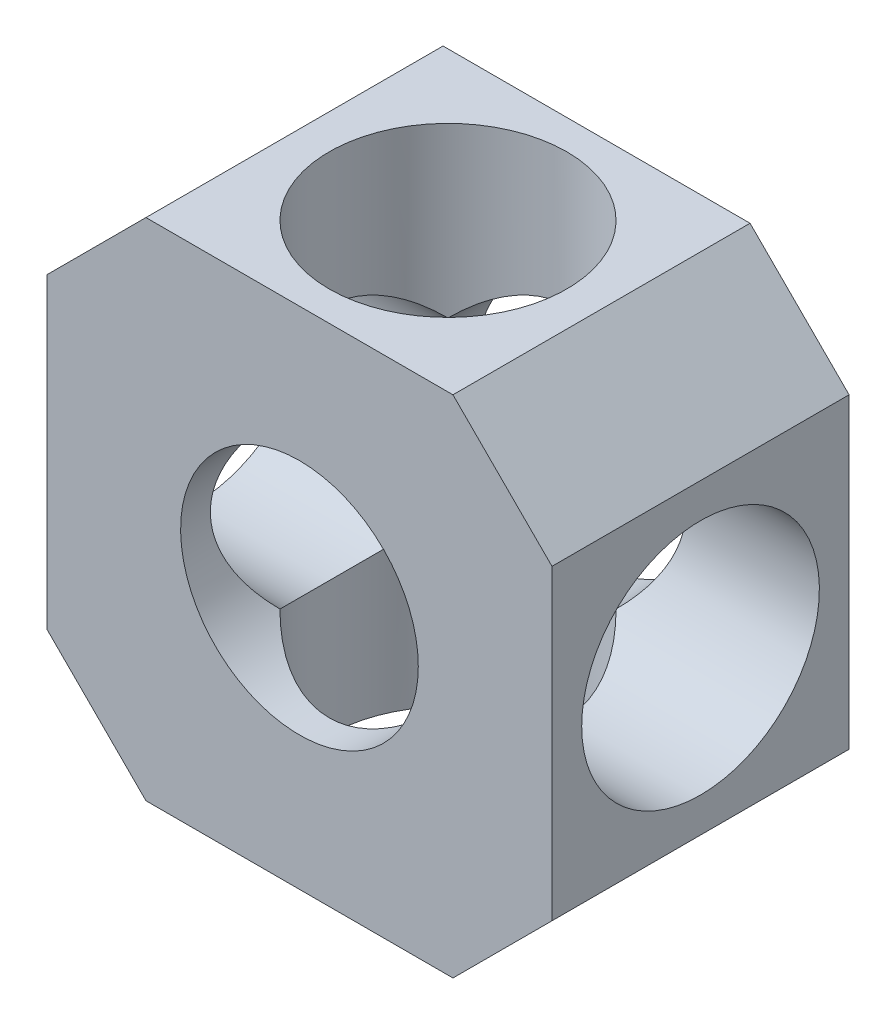
ISO-10303-21;
HEADER;
FILE_DESCRIPTION(('STEP AP214'),'2;1');
FILE_NAME('part.step','',(''),(''),'','','');
FILE_SCHEMA(('AUTOMOTIVE_DESIGN { 1 0 10303 214 1 1 1 1 }'));
ENDSEC;
DATA;
#1=APPLICATION_CONTEXT('core data for automotive mechanical design processes');
#2=APPLICATION_PROTOCOL_DEFINITION('international standard','automotive_design',2000,#1);
#3=PRODUCT_CONTEXT('',#1,'mechanical');
#4=PRODUCT('Part','Part','',(#3));
#5=PRODUCT_RELATED_PRODUCT_CATEGORY('part','',(#4));
#6=PRODUCT_DEFINITION_FORMATION('','',#4);
#7=PRODUCT_DEFINITION_CONTEXT('part definition',#1,'design');
#8=PRODUCT_DEFINITION('design','',#6,#7);
#9=PRODUCT_DEFINITION_SHAPE('','',#8);
#10=(LENGTH_UNIT() NAMED_UNIT(*) SI_UNIT(.MILLI.,.METRE.));
#11=(NAMED_UNIT(*) PLANE_ANGLE_UNIT() SI_UNIT($,.RADIAN.));
#12=(NAMED_UNIT(*) SI_UNIT($,.STERADIAN.) SOLID_ANGLE_UNIT());
#13=UNCERTAINTY_MEASURE_WITH_UNIT(LENGTH_MEASURE(1.E-05),#10,'distance_accuracy_value','');
#14=(GEOMETRIC_REPRESENTATION_CONTEXT(3) GLOBAL_UNCERTAINTY_ASSIGNED_CONTEXT((#13)) GLOBAL_UNIT_ASSIGNED_CONTEXT((#10,
#11,#12)) REPRESENTATION_CONTEXT('',''));
#15=CARTESIAN_POINT('',(0.,0.,0.));
#16=DIRECTION('',(0.,0.,1.));
#17=DIRECTION('',(1.,0.,0.));
#18=AXIS2_PLACEMENT_3D('',#15,#16,#17);
#19=CARTESIAN_POINT('',(0.,0.,6.21710526));
#20=DIRECTION('',(0.,0.,-1.));
#21=DIRECTION('',(-1.,0.,0.));
#22=AXIS2_PLACEMENT_3D('',#19,#20,#21);
#23=CYLINDRICAL_SURFACE('',#22,4.973684208);
#24=CARTESIAN_POINT('',(0.,0.,0.));
#25=DIRECTION('',(0.707106781186547,0.,-0.707106781186547));
#26=DIRECTION('',(-0.707106781186547,0.,-0.707106781186547));
#27=AXIS2_PLACEMENT_3D('',#24,#25,#26);
#28=ELLIPSE('',#27,7.03385166191449,4.973684208);
#29=CARTESIAN_POINT('',(3.51692583095726,-3.51692583095722,3.51692583095723));
#30=VERTEX_POINT('',#29);
#31=CARTESIAN_POINT('',(3.51692583095724,3.51692583095725,3.51692583095725));
#32=VERTEX_POINT('',#31);
#33=EDGE_CURVE('E63',#30,#32,#28,.F.);
#34=ORIENTED_EDGE('',*,*,#33,.F.);
#35=CARTESIAN_POINT('',(0.,0.,0.));
#36=DIRECTION('',(0.,-0.707106781186547,-0.707106781186547));
#37=DIRECTION('',(0.,0.707106781186547,-0.707106781186547));
#38=AXIS2_PLACEMENT_3D('',#35,#36,#37);
#39=ELLIPSE('',#38,7.03385166191449,4.973684208);
#40=CARTESIAN_POINT('',(-3.51692583095723,-3.51692583095727,3.51692583095726));
#41=VERTEX_POINT('',#40);
#42=EDGE_CURVE('E140',#41,#30,#39,.F.);
#43=ORIENTED_EDGE('',*,*,#42,.F.);
#44=CARTESIAN_POINT('',(0.,0.,0.));
#45=DIRECTION('',(-0.707106781186547,0.,-0.707106781186547));
#46=DIRECTION('',(0.707106781186547,0.,-0.707106781186547));
#47=AXIS2_PLACEMENT_3D('',#44,#45,#46);
#48=ELLIPSE('',#47,7.03385166191449,4.973684208);
#49=CARTESIAN_POINT('',(-3.51692583095726,3.51692583095722,3.51692583095723));
#50=VERTEX_POINT('',#49);
#51=EDGE_CURVE('E128',#50,#41,#48,.F.);
#52=ORIENTED_EDGE('',*,*,#51,.F.);
#53=CARTESIAN_POINT('',(0.,0.,0.));
#54=DIRECTION('',(0.,0.707106781186547,-0.707106781186547));
#55=DIRECTION('',(0.,-0.707106781186547,-0.707106781186547));
#56=AXIS2_PLACEMENT_3D('',#53,#54,#55);
#57=ELLIPSE('',#56,7.03385166191449,4.973684208);
#58=EDGE_CURVE('E134',#32,#50,#57,.F.);
#59=ORIENTED_EDGE('',*,*,#58,.F.);
#60=EDGE_LOOP('',(#34,#43,#52,#59));
#61=FACE_BOUND('',#60,.T.);
#62=CARTESIAN_POINT('',(0.,0.,6.21710526));
#63=DIRECTION('',(0.,0.,1.));
#64=DIRECTION('',(1.,0.,0.));
#65=AXIS2_PLACEMENT_3D('',#62,#63,#64);
#66=CIRCLE('',#65,4.973684208);
#67=CARTESIAN_POINT('',(4.973684208,0.,6.21710526));
#68=VERTEX_POINT('',#67);
#69=EDGE_CURVE('E196',#68,#68,#66,.T.);
#70=ORIENTED_EDGE('',*,*,#69,.T.);
#71=EDGE_LOOP('',(#70));
#72=FACE_BOUND('',#71,.T.);
#73=ADVANCED_FACE('F40',(#61,#72),#23,.F.);
#74=CARTESIAN_POINT('',(0.,0.,6.21710526));
#75=DIRECTION('',(0.,0.,1.));
#76=DIRECTION('',(1.,0.,0.));
#77=AXIS2_PLACEMENT_3D('',#74,#75,#76);
#78=PLANE('',#77);
#79=DIRECTION('',(-0.707106781186548,0.707106781186548,0.));
#80=VECTOR('',#79,1.);
#81=CARTESIAN_POINT('',(6.424342102,10.569078942,6.21710526));
#82=LINE('',#81,#80);
#83=CARTESIAN_POINT('',(10.569078942,6.424342102,6.21710526));
#84=VERTEX_POINT('',#83);
#85=CARTESIAN_POINT('',(6.424342102,10.569078942,6.21710526));
#86=VERTEX_POINT('',#85);
#87=EDGE_CURVE('E180',#84,#86,#82,.T.);
#88=ORIENTED_EDGE('',*,*,#87,.T.);
#89=DIRECTION('',(-1.,0.,0.));
#90=VECTOR('',#89,1.);
#91=CARTESIAN_POINT('',(-6.424342102,10.569078942,6.21710526));
#92=LINE('',#91,#90);
#93=CARTESIAN_POINT('',(-6.424342102,10.569078942,6.21710526));
#94=VERTEX_POINT('',#93);
#95=EDGE_CURVE('E208',#86,#94,#92,.T.);
#96=ORIENTED_EDGE('',*,*,#95,.T.);
#97=DIRECTION('',(-0.707106781186548,-0.707106781186548,0.));
#98=VECTOR('',#97,1.);
#99=CARTESIAN_POINT('',(-10.569078942,6.424342102,6.21710526));
#100=LINE('',#99,#98);
#101=CARTESIAN_POINT('',(-10.569078942,6.424342102,6.21710526));
#102=VERTEX_POINT('',#101);
#103=EDGE_CURVE('E206',#94,#102,#100,.T.);
#104=ORIENTED_EDGE('',*,*,#103,.T.);
#105=DIRECTION('',(0.,-1.,0.));
#106=VECTOR('',#105,1.);
#107=CARTESIAN_POINT('',(-10.569078942,6.424342102,6.21710526));
#108=LINE('',#107,#106);
#109=CARTESIAN_POINT('',(-10.569078942,-6.424342102,6.21710526));
#110=VERTEX_POINT('',#109);
#111=EDGE_CURVE('E204',#102,#110,#108,.T.);
#112=ORIENTED_EDGE('',*,*,#111,.T.);
#113=DIRECTION('',(0.707106781186548,-0.707106781186548,0.));
#114=VECTOR('',#113,1.);
#115=CARTESIAN_POINT('',(-10.569078942,-6.424342102,6.21710526));
#116=LINE('',#115,#114);
#117=CARTESIAN_POINT('',(-6.424342102,-10.569078942,6.21710526));
#118=VERTEX_POINT('',#117);
#119=EDGE_CURVE('E202',#110,#118,#116,.T.);
#120=ORIENTED_EDGE('',*,*,#119,.T.);
#121=DIRECTION('',(1.,0.,0.));
#122=VECTOR('',#121,1.);
#123=CARTESIAN_POINT('',(-6.424342102,-10.569078942,6.21710526));
#124=LINE('',#123,#122);
#125=CARTESIAN_POINT('',(6.424342102,-10.569078942,6.21710526));
#126=VERTEX_POINT('',#125);
#127=EDGE_CURVE('E200',#118,#126,#124,.T.);
#128=ORIENTED_EDGE('',*,*,#127,.T.);
#129=DIRECTION('',(0.707106781186548,0.707106781186548,0.));
#130=VECTOR('',#129,1.);
#131=CARTESIAN_POINT('',(6.424342102,-10.569078942,6.21710526));
#132=LINE('',#131,#130);
#133=CARTESIAN_POINT('',(10.569078942,-6.424342102,6.21710526));
#134=VERTEX_POINT('',#133);
#135=EDGE_CURVE('E198',#126,#134,#132,.T.);
#136=ORIENTED_EDGE('',*,*,#135,.T.);
#137=DIRECTION('',(0.,1.,0.));
#138=VECTOR('',#137,1.);
#139=CARTESIAN_POINT('',(10.569078942,6.424342102,6.21710526));
#140=LINE('',#139,#138);
#141=EDGE_CURVE('E177',#134,#84,#140,.T.);
#142=ORIENTED_EDGE('',*,*,#141,.T.);
#143=EDGE_LOOP('',(#88,#96,#104,#112,#120,#128,#136,#142));
#144=FACE_BOUND('',#143,.T.);
#145=ORIENTED_EDGE('',*,*,#69,.F.);
#146=EDGE_LOOP('',(#145));
#147=FACE_BOUND('',#146,.T.);
#148=ADVANCED_FACE('F274',(#144,#147),#78,.T.);
#149=CARTESIAN_POINT('',(0.,0.,-6.21710526));
#150=DIRECTION('',(0.,0.,1.));
#151=DIRECTION('',(1.,0.,0.));
#152=AXIS2_PLACEMENT_3D('',#149,#150,#151);
#153=PLANE('',#152);
#154=DIRECTION('',(-0.707106781186548,0.707106781186548,0.));
#155=VECTOR('',#154,1.);
#156=CARTESIAN_POINT('',(6.424342102,10.569078942,-6.21710526));
#157=LINE('',#156,#155);
#158=CARTESIAN_POINT('',(10.569078942,6.424342102,-6.21710526));
#159=VERTEX_POINT('',#158);
#160=CARTESIAN_POINT('',(6.424342102,10.569078942,-6.21710526));
#161=VERTEX_POINT('',#160);
#162=EDGE_CURVE('E193',#159,#161,#157,.T.);
#163=ORIENTED_EDGE('',*,*,#162,.F.);
#164=DIRECTION('',(0.,1.,0.));
#165=VECTOR('',#164,1.);
#166=CARTESIAN_POINT('',(10.569078942,6.424342102,-6.21710526));
#167=LINE('',#166,#165);
#168=CARTESIAN_POINT('',(10.569078942,-6.424342102,-6.21710526));
#169=VERTEX_POINT('',#168);
#170=EDGE_CURVE('E178',#169,#159,#167,.T.);
#171=ORIENTED_EDGE('',*,*,#170,.F.);
#172=DIRECTION('',(0.707106781186548,0.707106781186548,0.));
#173=VECTOR('',#172,1.);
#174=CARTESIAN_POINT('',(6.424342102,-10.569078942,-6.21710526));
#175=LINE('',#174,#173);
#176=CARTESIAN_POINT('',(6.424342102,-10.569078942,-6.21710526));
#177=VERTEX_POINT('',#176);
#178=EDGE_CURVE('E181',#177,#169,#175,.T.);
#179=ORIENTED_EDGE('',*,*,#178,.F.);
#180=DIRECTION('',(1.,0.,0.));
#181=VECTOR('',#180,1.);
#182=CARTESIAN_POINT('',(-6.424342102,-10.569078942,-6.21710526));
#183=LINE('',#182,#181);
#184=CARTESIAN_POINT('',(-6.424342102,-10.569078942,-6.21710526));
#185=VERTEX_POINT('',#184);
#186=EDGE_CURVE('E183',#185,#177,#183,.T.);
#187=ORIENTED_EDGE('',*,*,#186,.F.);
#188=DIRECTION('',(0.707106781186548,-0.707106781186548,0.));
#189=VECTOR('',#188,1.);
#190=CARTESIAN_POINT('',(-10.569078942,-6.424342102,-6.21710526));
#191=LINE('',#190,#189);
#192=CARTESIAN_POINT('',(-10.569078942,-6.424342102,-6.21710526));
#193=VERTEX_POINT('',#192);
#194=EDGE_CURVE('E185',#193,#185,#191,.T.);
#195=ORIENTED_EDGE('',*,*,#194,.F.);
#196=DIRECTION('',(0.,-1.,0.));
#197=VECTOR('',#196,1.);
#198=CARTESIAN_POINT('',(-10.569078942,6.424342102,-6.21710526));
#199=LINE('',#198,#197);
#200=CARTESIAN_POINT('',(-10.569078942,6.424342102,-6.21710526));
#201=VERTEX_POINT('',#200);
#202=EDGE_CURVE('E187',#201,#193,#199,.T.);
#203=ORIENTED_EDGE('',*,*,#202,.F.);
#204=DIRECTION('',(-0.707106781186548,-0.707106781186548,0.));
#205=VECTOR('',#204,1.);
#206=CARTESIAN_POINT('',(-10.569078942,6.424342102,-6.21710526));
#207=LINE('',#206,#205);
#208=CARTESIAN_POINT('',(-6.424342102,10.569078942,-6.21710526));
#209=VERTEX_POINT('',#208);
#210=EDGE_CURVE('E189',#209,#201,#207,.T.);
#211=ORIENTED_EDGE('',*,*,#210,.F.);
#212=DIRECTION('',(-1.,0.,0.));
#213=VECTOR('',#212,1.);
#214=CARTESIAN_POINT('',(-6.424342102,10.569078942,-6.21710526));
#215=LINE('',#214,#213);
#216=EDGE_CURVE('E191',#161,#209,#215,.T.);
#217=ORIENTED_EDGE('',*,*,#216,.F.);
#218=EDGE_LOOP('',(#163,#171,#179,#187,#195,#203,#211,#217));
#219=FACE_BOUND('',#218,.T.);
#220=CARTESIAN_POINT('',(0.,0.,-6.21710526));
#221=DIRECTION('',(0.,0.,1.));
#222=DIRECTION('',(1.,0.,0.));
#223=AXIS2_PLACEMENT_3D('',#220,#221,#222);
#224=CIRCLE('',#223,4.973684208);
#225=CARTESIAN_POINT('',(4.973684208,0.,-6.21710526));
#226=VERTEX_POINT('',#225);
#227=EDGE_CURVE('E212',#226,#226,#224,.T.);
#228=ORIENTED_EDGE('',*,*,#227,.T.);
#229=EDGE_LOOP('',(#228));
#230=FACE_BOUND('',#229,.T.);
#231=ADVANCED_FACE('F265',(#219,#230),#153,.F.);
#232=CARTESIAN_POINT('',(6.424342102,10.569078942,6.21710526));
#233=DIRECTION('',(-0.707106781186547,-0.707106781186547,0.));
#234=DIRECTION('',(0.707106781186548,-0.707106781186548,0.));
#235=AXIS2_PLACEMENT_3D('',#232,#233,#234);
#236=PLANE('',#235);
#237=ORIENTED_EDGE('',*,*,#162,.T.);
#238=DIRECTION('',(0.,0.,-1.));
#239=VECTOR('',#238,1.);
#240=CARTESIAN_POINT('',(6.424342102,10.569078942,6.21710526));
#241=LINE('',#240,#239);
#242=EDGE_CURVE('E153',#86,#161,#241,.T.);
#243=ORIENTED_EDGE('',*,*,#242,.F.);
#244=ORIENTED_EDGE('',*,*,#87,.F.);
#245=DIRECTION('',(0.,0.,-1.));
#246=VECTOR('',#245,1.);
#247=CARTESIAN_POINT('',(10.569078942,6.424342102,6.21710526));
#248=LINE('',#247,#246);
#249=EDGE_CURVE('E174',#84,#159,#248,.T.);
#250=ORIENTED_EDGE('',*,*,#249,.T.);
#251=EDGE_LOOP('',(#237,#243,#244,#250));
#252=FACE_BOUND('',#251,.T.);
#253=ADVANCED_FACE('F42',(#252),#236,.F.);
#254=CARTESIAN_POINT('',(-6.424342102,10.569078942,6.21710526));
#255=DIRECTION('',(0.,-1.,0.));
#256=DIRECTION('',(0.,0.,-1.));
#257=AXIS2_PLACEMENT_3D('',#254,#255,#256);
#258=PLANE('',#257);
#259=CARTESIAN_POINT('',(0.,10.569078942,0.));
#260=DIRECTION('',(0.,1.,0.));
#261=DIRECTION('',(0.,0.,1.));
#262=AXIS2_PLACEMENT_3D('',#259,#260,#261);
#263=CIRCLE('',#262,4.973684208);
#264=CARTESIAN_POINT('',(0.,10.569078942,4.973684208));
#265=VERTEX_POINT('',#264);
#266=EDGE_CURVE('E218',#265,#265,#263,.T.);
#267=ORIENTED_EDGE('',*,*,#266,.F.);
#268=EDGE_LOOP('',(#267));
#269=FACE_BOUND('',#268,.T.);
#270=ORIENTED_EDGE('',*,*,#216,.T.);
#271=DIRECTION('',(0.,0.,-1.));
#272=VECTOR('',#271,1.);
#273=CARTESIAN_POINT('',(-6.424342102,10.569078942,6.21710526));
#274=LINE('',#273,#272);
#275=EDGE_CURVE('E156',#94,#209,#274,.T.);
#276=ORIENTED_EDGE('',*,*,#275,.F.);
#277=ORIENTED_EDGE('',*,*,#95,.F.);
#278=ORIENTED_EDGE('',*,*,#242,.T.);
#279=EDGE_LOOP('',(#270,#276,#277,#278));
#280=FACE_BOUND('',#279,.T.);
#281=ADVANCED_FACE('F271',(#269,#280),#258,.F.);
#282=CARTESIAN_POINT('',(-10.569078942,6.424342102,6.21710526));
#283=DIRECTION('',(0.707106781186547,-0.707106781186547,0.));
#284=DIRECTION('',(0.707106781186548,0.707106781186548,0.));
#285=AXIS2_PLACEMENT_3D('',#282,#283,#284);
#286=PLANE('',#285);
#287=ORIENTED_EDGE('',*,*,#210,.T.);
#288=DIRECTION('',(0.,0.,-1.));
#289=VECTOR('',#288,1.);
#290=CARTESIAN_POINT('',(-10.569078942,6.424342102,6.21710526));
#291=LINE('',#290,#289);
#292=EDGE_CURVE('E159',#102,#201,#291,.T.);
#293=ORIENTED_EDGE('',*,*,#292,.F.);
#294=ORIENTED_EDGE('',*,*,#103,.F.);
#295=ORIENTED_EDGE('',*,*,#275,.T.);
#296=EDGE_LOOP('',(#287,#293,#294,#295));
#297=FACE_BOUND('',#296,.T.);
#298=ADVANCED_FACE('F294',(#297),#286,.F.);
#299=CARTESIAN_POINT('',(-10.569078942,6.424342102,6.21710526));
#300=DIRECTION('',(1.,0.,0.));
#301=DIRECTION('',(0.,1.,0.));
#302=AXIS2_PLACEMENT_3D('',#299,#300,#301);
#303=PLANE('',#302);
#304=CARTESIAN_POINT('',(-10.569078942,0.,0.));
#305=DIRECTION('',(-1.,0.,0.));
#306=DIRECTION('',(0.,0.,1.));
#307=AXIS2_PLACEMENT_3D('',#304,#305,#306);
#308=CIRCLE('',#307,4.973684208);
#309=CARTESIAN_POINT('',(-10.569078942,0.,4.973684208));
#310=VERTEX_POINT('',#309);
#311=EDGE_CURVE('E227',#310,#310,#308,.T.);
#312=ORIENTED_EDGE('',*,*,#311,.F.);
#313=EDGE_LOOP('',(#312));
#314=FACE_BOUND('',#313,.T.);
#315=ORIENTED_EDGE('',*,*,#202,.T.);
#316=DIRECTION('',(0.,0.,-1.));
#317=VECTOR('',#316,1.);
#318=CARTESIAN_POINT('',(-10.569078942,-6.424342102,6.21710526));
#319=LINE('',#318,#317);
#320=EDGE_CURVE('E162',#110,#193,#319,.T.);
#321=ORIENTED_EDGE('',*,*,#320,.F.);
#322=ORIENTED_EDGE('',*,*,#111,.F.);
#323=ORIENTED_EDGE('',*,*,#292,.T.);
#324=EDGE_LOOP('',(#315,#321,#322,#323));
#325=FACE_BOUND('',#324,.T.);
#326=ADVANCED_FACE('F291',(#314,#325),#303,.F.);
#327=CARTESIAN_POINT('',(-10.569078942,-6.424342102,6.21710526));
#328=DIRECTION('',(0.707106781186547,0.707106781186547,0.));
#329=DIRECTION('',(-0.707106781186548,0.707106781186548,0.));
#330=AXIS2_PLACEMENT_3D('',#327,#328,#329);
#331=PLANE('',#330);
#332=ORIENTED_EDGE('',*,*,#194,.T.);
#333=DIRECTION('',(0.,0.,-1.));
#334=VECTOR('',#333,1.);
#335=CARTESIAN_POINT('',(-6.424342102,-10.569078942,6.21710526));
#336=LINE('',#335,#334);
#337=EDGE_CURVE('E165',#118,#185,#336,.T.);
#338=ORIENTED_EDGE('',*,*,#337,.F.);
#339=ORIENTED_EDGE('',*,*,#119,.F.);
#340=ORIENTED_EDGE('',*,*,#320,.T.);
#341=EDGE_LOOP('',(#332,#338,#339,#340));
#342=FACE_BOUND('',#341,.T.);
#343=ADVANCED_FACE('F287',(#342),#331,.F.);
#344=CARTESIAN_POINT('',(-6.424342102,-10.569078942,6.21710526));
#345=DIRECTION('',(0.,1.,0.));
#346=DIRECTION('',(0.,0.,1.));
#347=AXIS2_PLACEMENT_3D('',#344,#345,#346);
#348=PLANE('',#347);
#349=CARTESIAN_POINT('',(0.,-10.569078942,0.));
#350=DIRECTION('',(0.,1.,0.));
#351=DIRECTION('',(0.,0.,1.));
#352=AXIS2_PLACEMENT_3D('',#349,#350,#351);
#353=CIRCLE('',#352,4.973684208);
#354=CARTESIAN_POINT('',(0.,-10.569078942,4.973684208));
#355=VERTEX_POINT('',#354);
#356=EDGE_CURVE('E215',#355,#355,#353,.T.);
#357=ORIENTED_EDGE('',*,*,#356,.T.);
#358=EDGE_LOOP('',(#357));
#359=FACE_BOUND('',#358,.T.);
#360=ORIENTED_EDGE('',*,*,#186,.T.);
#361=DIRECTION('',(0.,0.,-1.));
#362=VECTOR('',#361,1.);
#363=CARTESIAN_POINT('',(6.424342102,-10.569078942,6.21710526));
#364=LINE('',#363,#362);
#365=EDGE_CURVE('E168',#126,#177,#364,.T.);
#366=ORIENTED_EDGE('',*,*,#365,.F.);
#367=ORIENTED_EDGE('',*,*,#127,.F.);
#368=ORIENTED_EDGE('',*,*,#337,.T.);
#369=EDGE_LOOP('',(#360,#366,#367,#368));
#370=FACE_BOUND('',#369,.T.);
#371=ADVANCED_FACE('F283',(#359,#370),#348,.F.);
#372=CARTESIAN_POINT('',(6.424342102,-10.569078942,6.21710526));
#373=DIRECTION('',(-0.707106781186547,0.707106781186547,0.));
#374=DIRECTION('',(-0.707106781186548,-0.707106781186548,0.));
#375=AXIS2_PLACEMENT_3D('',#372,#373,#374);
#376=PLANE('',#375);
#377=ORIENTED_EDGE('',*,*,#178,.T.);
#378=DIRECTION('',(0.,0.,-1.));
#379=VECTOR('',#378,1.);
#380=CARTESIAN_POINT('',(10.569078942,-6.424342102,6.21710526));
#381=LINE('',#380,#379);
#382=EDGE_CURVE('E171',#134,#169,#381,.T.);
#383=ORIENTED_EDGE('',*,*,#382,.F.);
#384=ORIENTED_EDGE('',*,*,#135,.F.);
#385=ORIENTED_EDGE('',*,*,#365,.T.);
#386=EDGE_LOOP('',(#377,#383,#384,#385));
#387=FACE_BOUND('',#386,.T.);
#388=ADVANCED_FACE('F253',(#387),#376,.F.);
#389=CARTESIAN_POINT('',(10.569078942,6.424342102,6.21710526));
#390=DIRECTION('',(-1.,0.,0.));
#391=DIRECTION('',(0.,0.,1.));
#392=AXIS2_PLACEMENT_3D('',#389,#390,#391);
#393=PLANE('',#392);
#394=CARTESIAN_POINT('',(10.569078942,0.,0.));
#395=DIRECTION('',(-1.,0.,0.));
#396=DIRECTION('',(0.,0.,1.));
#397=AXIS2_PLACEMENT_3D('',#394,#395,#396);
#398=CIRCLE('',#397,4.973684208);
#399=CARTESIAN_POINT('',(10.569078942,0.,4.973684208));
#400=VERTEX_POINT('',#399);
#401=EDGE_CURVE('E226',#400,#400,#398,.T.);
#402=ORIENTED_EDGE('',*,*,#401,.T.);
#403=EDGE_LOOP('',(#402));
#404=FACE_BOUND('',#403,.T.);
#405=ORIENTED_EDGE('',*,*,#170,.T.);
#406=ORIENTED_EDGE('',*,*,#249,.F.);
#407=ORIENTED_EDGE('',*,*,#141,.F.);
#408=ORIENTED_EDGE('',*,*,#382,.T.);
#409=EDGE_LOOP('',(#405,#406,#407,#408));
#410=FACE_BOUND('',#409,.T.);
#411=ADVANCED_FACE('F250',(#404,#410),#393,.F.);
#412=CARTESIAN_POINT('',(0.,0.,0.));
#413=DIRECTION('',(-0.707106781186547,0.,-0.707106781186547));
#414=DIRECTION('',(0.707106781186547,0.,-0.707106781186547));
#415=AXIS2_PLACEMENT_3D('',#412,#413,#414);
#416=ELLIPSE('',#415,7.03385166191449,4.973684208);
#417=CARTESIAN_POINT('',(3.51692583095723,3.51692583095727,-3.51692583095726));
#418=VERTEX_POINT('',#417);
#419=CARTESIAN_POINT('',(3.51692583095726,-3.51692583095722,-3.51692583095723));
#420=VERTEX_POINT('',#419);
#421=EDGE_CURVE('E141',#418,#420,#416,.T.);
#422=ORIENTED_EDGE('',*,*,#421,.F.);
#423=CARTESIAN_POINT('',(0.,0.,0.));
#424=DIRECTION('',(0.,-0.707106781186547,-0.707106781186547));
#425=DIRECTION('',(0.,0.707106781186547,-0.707106781186547));
#426=AXIS2_PLACEMENT_3D('',#423,#424,#425);
#427=ELLIPSE('',#426,7.03385166191449,4.973684208);
#428=CARTESIAN_POINT('',(-3.51692583095725,3.51692583095724,-3.51692583095724));
#429=VERTEX_POINT('',#428);
#430=EDGE_CURVE('E148',#429,#418,#427,.T.);
#431=ORIENTED_EDGE('',*,*,#430,.F.);
#432=CARTESIAN_POINT('',(0.,0.,0.));
#433=DIRECTION('',(0.707106781186547,0.,-0.707106781186547));
#434=DIRECTION('',(-0.707106781186547,0.,-0.707106781186547));
#435=AXIS2_PLACEMENT_3D('',#432,#433,#434);
#436=ELLIPSE('',#435,7.03385166191449,4.973684208);
#437=CARTESIAN_POINT('',(-3.51692583095723,-3.51692583095727,-3.51692583095726));
#438=VERTEX_POINT('',#437);
#439=EDGE_CURVE('E55',#438,#429,#436,.T.);
#440=ORIENTED_EDGE('',*,*,#439,.F.);
#441=CARTESIAN_POINT('',(0.,0.,0.));
#442=DIRECTION('',(0.,0.707106781186547,-0.707106781186547));
#443=DIRECTION('',(0.,-0.707106781186547,-0.707106781186547));
#444=AXIS2_PLACEMENT_3D('',#441,#442,#443);
#445=ELLIPSE('',#444,7.03385166191449,4.973684208);
#446=EDGE_CURVE('E145',#420,#438,#445,.T.);
#447=ORIENTED_EDGE('',*,*,#446,.F.);
#448=EDGE_LOOP('',(#422,#431,#440,#447));
#449=FACE_BOUND('',#448,.T.);
#450=ORIENTED_EDGE('',*,*,#227,.F.);
#451=EDGE_LOOP('',(#450));
#452=FACE_BOUND('',#451,.T.);
#453=ADVANCED_FACE('F242',(#449,#452),#23,.F.);
#454=CARTESIAN_POINT('',(0.,-10.569078942,0.));
#455=DIRECTION('',(0.,1.,0.));
#456=DIRECTION('',(0.,0.,1.));
#457=AXIS2_PLACEMENT_3D('',#454,#455,#456);
#458=CYLINDRICAL_SURFACE('',#457,4.973684208);
#459=ORIENTED_EDGE('',*,*,#42,.T.);
#460=CARTESIAN_POINT('',(0.,0.,0.));
#461=DIRECTION('',(-0.707106781186544,-0.707106781186551,0.));
#462=DIRECTION('',(0.707106781186551,-0.707106781186544,0.));
#463=AXIS2_PLACEMENT_3D('',#460,#461,#462);
#464=ELLIPSE('',#463,7.03385166191445,4.973684208);
#465=EDGE_CURVE('E234',#30,#420,#464,.F.);
#466=ORIENTED_EDGE('',*,*,#465,.T.);
#467=ORIENTED_EDGE('',*,*,#446,.T.);
#468=CARTESIAN_POINT('',(0.,0.,0.));
#469=DIRECTION('',(0.707106781186551,-0.707106781186544,0.));
#470=DIRECTION('',(-0.707106781186544,-0.707106781186551,0.));
#471=AXIS2_PLACEMENT_3D('',#468,#469,#470);
#472=ELLIPSE('',#471,7.03385166191453,4.973684208);
#473=EDGE_CURVE('E230',#438,#41,#472,.F.);
#474=ORIENTED_EDGE('',*,*,#473,.T.);
#475=EDGE_LOOP('',(#459,#466,#467,#474));
#476=FACE_BOUND('',#475,.T.);
#477=ORIENTED_EDGE('',*,*,#356,.F.);
#478=EDGE_LOOP('',(#477));
#479=FACE_BOUND('',#478,.T.);
#480=ADVANCED_FACE('F238',(#476,#479),#458,.F.);
#481=ORIENTED_EDGE('',*,*,#430,.T.);
#482=CARTESIAN_POINT('',(0.,0.,0.));
#483=DIRECTION('',(-0.707106781186549,0.707106781186546,0.));
#484=DIRECTION('',(0.707106781186546,0.707106781186549,0.));
#485=AXIS2_PLACEMENT_3D('',#482,#483,#484);
#486=ELLIPSE('',#485,7.0338516619145,4.973684208);
#487=EDGE_CURVE('E11',#418,#32,#486,.F.);
#488=ORIENTED_EDGE('',*,*,#487,.T.);
#489=ORIENTED_EDGE('',*,*,#58,.T.);
#490=CARTESIAN_POINT('',(0.,0.,0.));
#491=DIRECTION('',(0.707106781186546,0.707106781186549,0.));
#492=DIRECTION('',(-0.707106781186549,0.707106781186546,0.));
#493=AXIS2_PLACEMENT_3D('',#490,#491,#492);
#494=ELLIPSE('',#493,7.03385166191448,4.973684208);
#495=EDGE_CURVE('E48',#50,#429,#494,.F.);
#496=ORIENTED_EDGE('',*,*,#495,.T.);
#497=EDGE_LOOP('',(#481,#488,#489,#496));
#498=FACE_BOUND('',#497,.T.);
#499=ORIENTED_EDGE('',*,*,#266,.T.);
#500=EDGE_LOOP('',(#499));
#501=FACE_BOUND('',#500,.T.);
#502=ADVANCED_FACE('F143',(#498,#501),#458,.F.);
#503=CARTESIAN_POINT('',(10.569078942,0.,0.));
#504=DIRECTION('',(-1.,0.,0.));
#505=DIRECTION('',(0.,-1.,0.));
#506=AXIS2_PLACEMENT_3D('',#503,#504,#505);
#507=CYLINDRICAL_SURFACE('',#506,4.973684208);
#508=ORIENTED_EDGE('',*,*,#51,.T.);
#509=ORIENTED_EDGE('',*,*,#473,.F.);
#510=ORIENTED_EDGE('',*,*,#439,.T.);
#511=ORIENTED_EDGE('',*,*,#495,.F.);
#512=EDGE_LOOP('',(#508,#509,#510,#511));
#513=FACE_BOUND('',#512,.T.);
#514=ORIENTED_EDGE('',*,*,#311,.T.);
#515=EDGE_LOOP('',(#514));
#516=FACE_BOUND('',#515,.T.);
#517=ADVANCED_FACE('F126',(#513,#516),#507,.F.);
#518=ORIENTED_EDGE('',*,*,#33,.T.);
#519=ORIENTED_EDGE('',*,*,#487,.F.);
#520=ORIENTED_EDGE('',*,*,#421,.T.);
#521=ORIENTED_EDGE('',*,*,#465,.F.);
#522=EDGE_LOOP('',(#518,#519,#520,#521));
#523=FACE_BOUND('',#522,.T.);
#524=ORIENTED_EDGE('',*,*,#401,.F.);
#525=EDGE_LOOP('',(#524));
#526=FACE_BOUND('',#525,.T.);
#527=ADVANCED_FACE('F244',(#523,#526),#507,.F.);
#528=CLOSED_SHELL('',(#73,#148,#231,#253,#281,#298,#326,#343,#371,#388,#411,#453,#480,#502,#517,#527));
#529=MANIFOLD_SOLID_BREP('B2',#528);
#530=ADVANCED_BREP_SHAPE_REPRESENTATION('',(#18,#529),#14);
#531=SHAPE_DEFINITION_REPRESENTATION(#9,#530);
ENDSEC;
END-ISO-10303-21;
